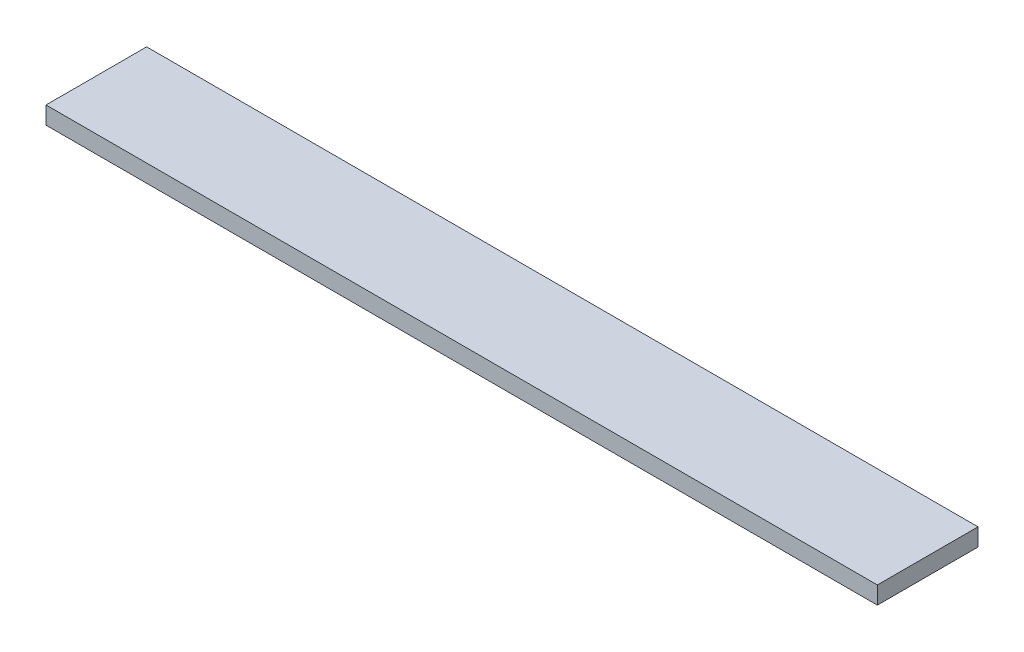
ISO-10303-21;
HEADER;
FILE_DESCRIPTION(('STEP AP214'),'2;1');
FILE_NAME('part.step','',(''),(''),'','','');
FILE_SCHEMA(('AUTOMOTIVE_DESIGN { 1 0 10303 214 1 1 1 1 }'));
ENDSEC;
DATA;
#1=APPLICATION_CONTEXT('core data for automotive mechanical design processes');
#2=APPLICATION_PROTOCOL_DEFINITION('international standard','automotive_design',2000,#1);
#3=PRODUCT_CONTEXT('',#1,'mechanical');
#4=PRODUCT('Part','Part','',(#3));
#5=PRODUCT_RELATED_PRODUCT_CATEGORY('part','',(#4));
#6=PRODUCT_DEFINITION_FORMATION('','',#4);
#7=PRODUCT_DEFINITION_CONTEXT('part definition',#1,'design');
#8=PRODUCT_DEFINITION('design','',#6,#7);
#9=PRODUCT_DEFINITION_SHAPE('','',#8);
#10=(LENGTH_UNIT() NAMED_UNIT(*) SI_UNIT(.MILLI.,.METRE.));
#11=(NAMED_UNIT(*) PLANE_ANGLE_UNIT() SI_UNIT($,.RADIAN.));
#12=(NAMED_UNIT(*) SI_UNIT($,.STERADIAN.) SOLID_ANGLE_UNIT());
#13=UNCERTAINTY_MEASURE_WITH_UNIT(LENGTH_MEASURE(1.E-05),#10,'distance_accuracy_value','');
#14=(GEOMETRIC_REPRESENTATION_CONTEXT(3) GLOBAL_UNCERTAINTY_ASSIGNED_CONTEXT((#13)) GLOBAL_UNIT_ASSIGNED_CONTEXT((#10,
#11,#12)) REPRESENTATION_CONTEXT('',''));
#15=CARTESIAN_POINT('',(0.,0.,0.));
#16=DIRECTION('',(0.,0.,1.));
#17=DIRECTION('',(1.,0.,0.));
#18=AXIS2_PLACEMENT_3D('',#15,#16,#17);
#19=CARTESIAN_POINT('',(2413.,101.6,-584.2));
#20=DIRECTION('',(-1.,0.,0.));
#21=DIRECTION('',(0.,0.,1.));
#22=AXIS2_PLACEMENT_3D('',#19,#20,#21);
#23=PLANE('',#22);
#24=DIRECTION('',(0.,0.,-1.));
#25=VECTOR('',#24,1.);
#26=CARTESIAN_POINT('',(2413.,0.,-584.2));
#27=LINE('',#26,#25);
#28=CARTESIAN_POINT('',(2413.,0.,584.2));
#29=VERTEX_POINT('',#28);
#30=CARTESIAN_POINT('',(2413.,0.,1.11022302462516E-13));
#31=VERTEX_POINT('',#30);
#32=EDGE_CURVE('E86',#29,#31,#27,.T.);
#33=ORIENTED_EDGE('',*,*,#32,.T.);
#34=DIRECTION('',(0.,1.,0.));
#35=VECTOR('',#34,1.);
#36=CARTESIAN_POINT('',(2413.,0.,1.11022302462516E-13));
#37=LINE('',#36,#35);
#38=CARTESIAN_POINT('',(2413.,101.6,1.11022302462516E-13));
#39=VERTEX_POINT('',#38);
#40=EDGE_CURVE('E52',#31,#39,#37,.T.);
#41=ORIENTED_EDGE('',*,*,#40,.T.);
#42=DIRECTION('',(0.,0.,-1.));
#43=VECTOR('',#42,1.);
#44=CARTESIAN_POINT('',(2413.,101.6,-584.2));
#45=LINE('',#44,#43);
#46=CARTESIAN_POINT('',(2413.,101.6,584.2));
#47=VERTEX_POINT('',#46);
#48=EDGE_CURVE('E81',#47,#39,#45,.T.);
#49=ORIENTED_EDGE('',*,*,#48,.F.);
#50=DIRECTION('',(0.,-1.,0.));
#51=VECTOR('',#50,1.);
#52=CARTESIAN_POINT('',(2413.,101.6,584.2));
#53=LINE('',#52,#51);
#54=EDGE_CURVE('E45',#47,#29,#53,.T.);
#55=ORIENTED_EDGE('',*,*,#54,.T.);
#56=EDGE_LOOP('',(#33,#41,#49,#55));
#57=FACE_BOUND('',#56,.T.);
#58=ADVANCED_FACE('F38',(#57),#23,.F.);
#59=CARTESIAN_POINT('',(-2413.,101.6,-584.2));
#60=DIRECTION('',(1.,0.,0.));
#61=DIRECTION('',(0.,0.,-1.));
#62=AXIS2_PLACEMENT_3D('',#59,#60,#61);
#63=PLANE('',#62);
#64=DIRECTION('',(0.,0.,1.));
#65=VECTOR('',#64,1.);
#66=CARTESIAN_POINT('',(-2413.,101.6,-584.2));
#67=LINE('',#66,#65);
#68=CARTESIAN_POINT('',(-2413.,101.6,1.11022302462516E-13));
#69=VERTEX_POINT('',#68);
#70=CARTESIAN_POINT('',(-2413.,101.6,584.2));
#71=VERTEX_POINT('',#70);
#72=EDGE_CURVE('E95',#69,#71,#67,.T.);
#73=ORIENTED_EDGE('',*,*,#72,.F.);
#74=DIRECTION('',(0.,1.,0.));
#75=VECTOR('',#74,1.);
#76=CARTESIAN_POINT('',(-2413.,0.,1.11022302462516E-13));
#77=LINE('',#76,#75);
#78=CARTESIAN_POINT('',(-2413.,0.,1.11022302462516E-13));
#79=VERTEX_POINT('',#78);
#80=EDGE_CURVE('E91',#79,#69,#77,.T.);
#81=ORIENTED_EDGE('',*,*,#80,.F.);
#82=DIRECTION('',(0.,0.,1.));
#83=VECTOR('',#82,1.);
#84=CARTESIAN_POINT('',(-2413.,0.,-584.2));
#85=LINE('',#84,#83);
#86=CARTESIAN_POINT('',(-2413.,0.,584.2));
#87=VERTEX_POINT('',#86);
#88=EDGE_CURVE('E82',#79,#87,#85,.T.);
#89=ORIENTED_EDGE('',*,*,#88,.T.);
#90=DIRECTION('',(0.,-1.,0.));
#91=VECTOR('',#90,1.);
#92=CARTESIAN_POINT('',(-2413.,101.6,584.2));
#93=LINE('',#92,#91);
#94=EDGE_CURVE('E11',#71,#87,#93,.T.);
#95=ORIENTED_EDGE('',*,*,#94,.F.);
#96=EDGE_LOOP('',(#73,#81,#89,#95));
#97=FACE_BOUND('',#96,.T.);
#98=ADVANCED_FACE('F116',(#97),#63,.F.);
#99=CARTESIAN_POINT('',(-2413.,101.6,584.2));
#100=DIRECTION('',(0.,0.,-1.));
#101=DIRECTION('',(-1.,0.,0.));
#102=AXIS2_PLACEMENT_3D('',#99,#100,#101);
#103=PLANE('',#102);
#104=DIRECTION('',(1.,0.,0.));
#105=VECTOR('',#104,1.);
#106=CARTESIAN_POINT('',(-2413.,0.,584.2));
#107=LINE('',#106,#105);
#108=EDGE_CURVE('E73',#87,#29,#107,.T.);
#109=ORIENTED_EDGE('',*,*,#108,.T.);
#110=ORIENTED_EDGE('',*,*,#54,.F.);
#111=DIRECTION('',(1.,0.,0.));
#112=VECTOR('',#111,1.);
#113=CARTESIAN_POINT('',(-2413.,101.6,584.2));
#114=LINE('',#113,#112);
#115=EDGE_CURVE('E61',#71,#47,#114,.T.);
#116=ORIENTED_EDGE('',*,*,#115,.F.);
#117=ORIENTED_EDGE('',*,*,#94,.T.);
#118=EDGE_LOOP('',(#109,#110,#116,#117));
#119=FACE_BOUND('',#118,.T.);
#120=ADVANCED_FACE('F75',(#119),#103,.F.);
#121=CARTESIAN_POINT('',(0.,101.6,0.));
#122=DIRECTION('',(0.,1.,0.));
#123=DIRECTION('',(0.,0.,1.));
#124=AXIS2_PLACEMENT_3D('',#121,#122,#123);
#125=PLANE('',#124);
#126=DIRECTION('',(1.,0.,0.));
#127=VECTOR('',#126,1.);
#128=CARTESIAN_POINT('',(-2413.,101.6,1.11022302462516E-13));
#129=LINE('',#128,#127);
#130=EDGE_CURVE('E100',#69,#39,#129,.T.);
#131=ORIENTED_EDGE('',*,*,#130,.F.);
#132=ORIENTED_EDGE('',*,*,#72,.T.);
#133=ORIENTED_EDGE('',*,*,#115,.T.);
#134=ORIENTED_EDGE('',*,*,#48,.T.);
#135=EDGE_LOOP('',(#131,#132,#133,#134));
#136=FACE_BOUND('',#135,.T.);
#137=ADVANCED_FACE('F108',(#136),#125,.T.);
#138=CARTESIAN_POINT('',(0.,0.,0.));
#139=DIRECTION('',(0.,1.,0.));
#140=DIRECTION('',(0.,0.,1.));
#141=AXIS2_PLACEMENT_3D('',#138,#139,#140);
#142=PLANE('',#141);
#143=ORIENTED_EDGE('',*,*,#88,.F.);
#144=DIRECTION('',(1.,0.,0.));
#145=VECTOR('',#144,1.);
#146=CARTESIAN_POINT('',(-2413.,0.,1.11022302462516E-13));
#147=LINE('',#146,#145);
#148=EDGE_CURVE('E88',#79,#31,#147,.T.);
#149=ORIENTED_EDGE('',*,*,#148,.T.);
#150=ORIENTED_EDGE('',*,*,#32,.F.);
#151=ORIENTED_EDGE('',*,*,#108,.F.);
#152=EDGE_LOOP('',(#143,#149,#150,#151));
#153=FACE_BOUND('',#152,.T.);
#154=ADVANCED_FACE('F87',(#153),#142,.F.);
#155=CARTESIAN_POINT('',(-2413.,0.,1.11022302462516E-13));
#156=DIRECTION('',(0.,0.,1.));
#157=DIRECTION('',(1.,0.,0.));
#158=AXIS2_PLACEMENT_3D('',#155,#156,#157);
#159=PLANE('',#158);
#160=ORIENTED_EDGE('',*,*,#130,.T.);
#161=ORIENTED_EDGE('',*,*,#40,.F.);
#162=ORIENTED_EDGE('',*,*,#148,.F.);
#163=ORIENTED_EDGE('',*,*,#80,.T.);
#164=EDGE_LOOP('',(#160,#161,#162,#163));
#165=FACE_BOUND('',#164,.T.);
#166=ADVANCED_FACE('F104',(#165),#159,.F.);
#167=CLOSED_SHELL('',(#58,#98,#120,#137,#154,#166));
#168=MANIFOLD_SOLID_BREP('B2',#167);
#169=ADVANCED_BREP_SHAPE_REPRESENTATION('',(#18,#168),#14);
#170=SHAPE_DEFINITION_REPRESENTATION(#9,#169);
ENDSEC;
END-ISO-10303-21;
